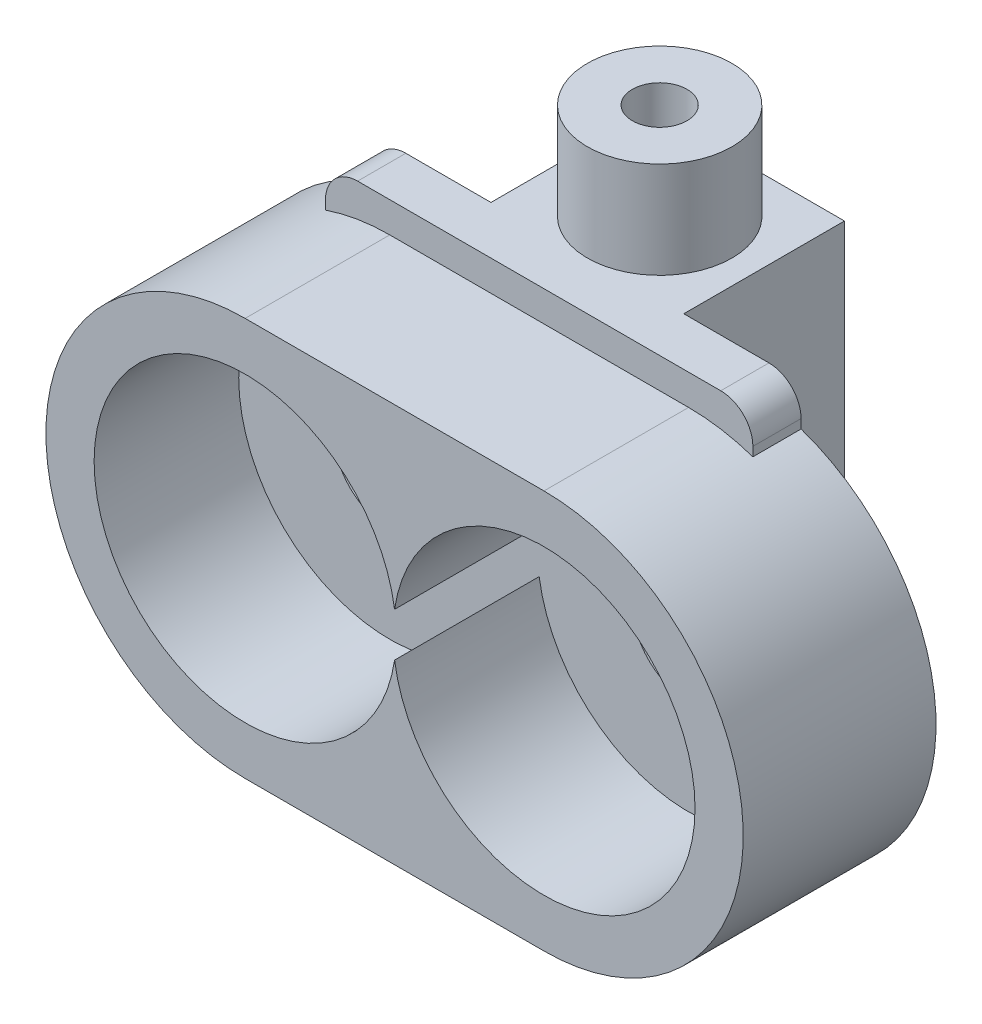
ISO-10303-21;
HEADER;
FILE_DESCRIPTION(('STEP AP214'),'2;1');
FILE_NAME('part.step','',(''),(''),'','','');
FILE_SCHEMA(('AUTOMOTIVE_DESIGN { 1 0 10303 214 1 1 1 1 }'));
ENDSEC;
DATA;
#1=APPLICATION_CONTEXT('core data for automotive mechanical design processes');
#2=APPLICATION_PROTOCOL_DEFINITION('international standard','automotive_design',2000,#1);
#3=PRODUCT_CONTEXT('',#1,'mechanical');
#4=PRODUCT('Part','Part','',(#3));
#5=PRODUCT_RELATED_PRODUCT_CATEGORY('part','',(#4));
#6=PRODUCT_DEFINITION_FORMATION('','',#4);
#7=PRODUCT_DEFINITION_CONTEXT('part definition',#1,'design');
#8=PRODUCT_DEFINITION('design','',#6,#7);
#9=PRODUCT_DEFINITION_SHAPE('','',#8);
#10=(LENGTH_UNIT() NAMED_UNIT(*) SI_UNIT(.MILLI.,.METRE.));
#11=(NAMED_UNIT(*) PLANE_ANGLE_UNIT() SI_UNIT($,.RADIAN.));
#12=(NAMED_UNIT(*) SI_UNIT($,.STERADIAN.) SOLID_ANGLE_UNIT());
#13=UNCERTAINTY_MEASURE_WITH_UNIT(LENGTH_MEASURE(1.E-05),#10,'distance_accuracy_value','');
#14=(GEOMETRIC_REPRESENTATION_CONTEXT(3) GLOBAL_UNCERTAINTY_ASSIGNED_CONTEXT((#13)) GLOBAL_UNIT_ASSIGNED_CONTEXT((#10,
#11,#12)) REPRESENTATION_CONTEXT('',''));
#15=CARTESIAN_POINT('',(0.,0.,0.));
#16=DIRECTION('',(0.,0.,1.));
#17=DIRECTION('',(1.,0.,0.));
#18=AXIS2_PLACEMENT_3D('',#15,#16,#17);
#19=CARTESIAN_POINT('',(136.,508.5,449.72));
#20=DIRECTION('',(0.,-1.,0.));
#21=DIRECTION('',(0.,0.,-1.));
#22=AXIS2_PLACEMENT_3D('',#19,#20,#21);
#23=PLANE('',#22);
#24=CARTESIAN_POINT('',(136.,508.5,449.72));
#25=DIRECTION('',(0.,-1.,0.));
#26=DIRECTION('',(1.,0.,0.));
#27=AXIS2_PLACEMENT_3D('',#24,#25,#26);
#28=CIRCLE('',#27,1.7);
#29=CARTESIAN_POINT('',(137.7,508.5,449.72));
#30=VERTEX_POINT('',#29);
#31=EDGE_CURVE('E23',#30,#30,#28,.T.);
#32=ORIENTED_EDGE('',*,*,#31,.F.);
#33=EDGE_LOOP('',(#32));
#34=FACE_BOUND('',#33,.T.);
#35=ADVANCED_FACE('F15',(#34),#23,.F.);
#36=CARTESIAN_POINT('',(136.,508.5,449.72));
#37=DIRECTION('',(0.,-1.,0.));
#38=DIRECTION('',(1.,0.,0.));
#39=AXIS2_PLACEMENT_3D('',#36,#37,#38);
#40=CYLINDRICAL_SURFACE('',#39,1.7);
#41=DIRECTION('',(0.,1.,0.));
#42=VECTOR('',#41,1.);
#43=CARTESIAN_POINT('',(137.7,508.5,449.72));
#44=LINE('',#43,#42);
#45=CARTESIAN_POINT('',(137.7,513.5,449.72));
#46=VERTEX_POINT('',#45);
#47=CARTESIAN_POINT('',(137.7,524.69,449.72));
#48=VERTEX_POINT('',#47);
#49=EDGE_CURVE('E9',#46,#48,#44,.T.);
#50=ORIENTED_EDGE('',*,*,#49,.T.);
#51=CARTESIAN_POINT('',(136.,524.69,449.72));
#52=DIRECTION('',(0.,-1.,0.));
#53=DIRECTION('',(1.,0.,0.));
#54=AXIS2_PLACEMENT_3D('',#51,#52,#53);
#55=CIRCLE('',#54,1.7);
#56=EDGE_CURVE('E316',#48,#48,#55,.T.);
#57=ORIENTED_EDGE('',*,*,#56,.F.);
#58=ORIENTED_EDGE('',*,*,#49,.F.);
#59=CARTESIAN_POINT('',(136.,513.5,449.72));
#60=DIRECTION('',(0.,-1.,0.));
#61=DIRECTION('',(1.,0.,0.));
#62=AXIS2_PLACEMENT_3D('',#59,#60,#61);
#63=CIRCLE('',#62,1.7);
#64=EDGE_CURVE('E413',#46,#46,#63,.T.);
#65=ORIENTED_EDGE('',*,*,#64,.T.);
#66=EDGE_LOOP('',(#50,#57,#58,#65));
#67=FACE_BOUND('',#66,.T.);
#68=ADVANCED_FACE('F670',(#67),#40,.F.);
#69=CARTESIAN_POINT('',(136.,508.5,449.72));
#70=DIRECTION('',(0.,-1.,0.));
#71=DIRECTION('',(1.,0.,0.));
#72=AXIS2_PLACEMENT_3D('',#69,#70,#71);
#73=CYLINDRICAL_SURFACE('',#72,1.7);
#74=CARTESIAN_POINT('',(136.,510.9,449.72));
#75=DIRECTION('',(0.,-1.,0.));
#76=DIRECTION('',(1.,0.,0.));
#77=AXIS2_PLACEMENT_3D('',#74,#75,#76);
#78=CIRCLE('',#77,1.7);
#79=CARTESIAN_POINT('',(137.7,510.9,449.72));
#80=VERTEX_POINT('',#79);
#81=EDGE_CURVE('E397',#80,#80,#78,.T.);
#82=ORIENTED_EDGE('',*,*,#81,.F.);
#83=DIRECTION('',(0.,1.,0.));
#84=VECTOR('',#83,1.);
#85=CARTESIAN_POINT('',(137.7,508.5,449.72));
#86=LINE('',#85,#84);
#87=EDGE_CURVE('E327',#30,#80,#86,.T.);
#88=ORIENTED_EDGE('',*,*,#87,.F.);
#89=ORIENTED_EDGE('',*,*,#31,.T.);
#90=ORIENTED_EDGE('',*,*,#87,.T.);
#91=EDGE_LOOP('',(#82,#88,#89,#90));
#92=FACE_BOUND('',#91,.T.);
#93=ADVANCED_FACE('F675',(#92),#73,.F.);
#94=CARTESIAN_POINT('',(133.1,510.9,453.12));
#95=DIRECTION('',(0.,0.,1.));
#96=DIRECTION('',(1.,0.,0.));
#97=AXIS2_PLACEMENT_3D('',#94,#95,#96);
#98=PLANE('',#97);
#99=DIRECTION('',(1.,0.,0.));
#100=VECTOR('',#99,1.);
#101=CARTESIAN_POINT('',(133.1,513.5,453.12));
#102=LINE('',#101,#100);
#103=CARTESIAN_POINT('',(133.1,513.5,453.12));
#104=VERTEX_POINT('',#103);
#105=CARTESIAN_POINT('',(138.9,513.5,453.12));
#106=VERTEX_POINT('',#105);
#107=EDGE_CURVE('E409',#104,#106,#102,.T.);
#108=ORIENTED_EDGE('',*,*,#107,.T.);
#109=DIRECTION('',(0.,1.,0.));
#110=VECTOR('',#109,1.);
#111=CARTESIAN_POINT('',(138.9,510.9,453.12));
#112=LINE('',#111,#110);
#113=CARTESIAN_POINT('',(138.9,510.9,453.12));
#114=VERTEX_POINT('',#113);
#115=EDGE_CURVE('E401',#114,#106,#112,.T.);
#116=ORIENTED_EDGE('',*,*,#115,.F.);
#117=DIRECTION('',(1.,0.,0.));
#118=VECTOR('',#117,1.);
#119=CARTESIAN_POINT('',(133.1,510.9,453.12));
#120=LINE('',#119,#118);
#121=CARTESIAN_POINT('',(133.1,510.9,453.12));
#122=VERTEX_POINT('',#121);
#123=EDGE_CURVE('E396',#122,#114,#120,.T.);
#124=ORIENTED_EDGE('',*,*,#123,.F.);
#125=DIRECTION('',(0.,1.,0.));
#126=VECTOR('',#125,1.);
#127=CARTESIAN_POINT('',(133.1,510.9,453.12));
#128=LINE('',#127,#126);
#129=EDGE_CURVE('E339',#122,#104,#128,.T.);
#130=ORIENTED_EDGE('',*,*,#129,.T.);
#131=EDGE_LOOP('',(#108,#116,#124,#130));
#132=FACE_BOUND('',#131,.T.);
#133=ADVANCED_FACE('F651',(#132),#98,.F.);
#134=CARTESIAN_POINT('',(136.,524.69,449.72));
#135=DIRECTION('',(0.,-1.,0.));
#136=DIRECTION('',(0.,0.,-1.));
#137=AXIS2_PLACEMENT_3D('',#134,#135,#136);
#138=PLANE('',#137);
#139=ORIENTED_EDGE('',*,*,#56,.T.);
#140=EDGE_LOOP('',(#139));
#141=FACE_BOUND('',#140,.T.);
#142=CARTESIAN_POINT('',(136.,524.69,449.72));
#143=DIRECTION('',(0.,-1.,0.));
#144=DIRECTION('',(1.,0.,0.));
#145=AXIS2_PLACEMENT_3D('',#142,#143,#144);
#146=CIRCLE('',#145,4.5);
#147=CARTESIAN_POINT('',(140.5,524.69,449.72));
#148=VERTEX_POINT('',#147);
#149=EDGE_CURVE('E277',#148,#148,#146,.T.);
#150=ORIENTED_EDGE('',*,*,#149,.F.);
#151=EDGE_LOOP('',(#150));
#152=FACE_BOUND('',#151,.T.);
#153=ADVANCED_FACE('F681',(#141,#152),#138,.F.);
#154=CARTESIAN_POINT('',(145.3,504.39,457.22));
#155=DIRECTION('',(0.,0.,-1.));
#156=DIRECTION('',(1.,0.,0.));
#157=AXIS2_PLACEMENT_3D('',#154,#155,#156);
#158=CYLINDRICAL_SURFACE('',#157,9.4);
#159=CARTESIAN_POINT('',(145.3,504.39,466.22));
#160=DIRECTION('',(0.,0.,-1.));
#161=DIRECTION('',(1.,0.,0.));
#162=AXIS2_PLACEMENT_3D('',#159,#160,#161);
#163=CIRCLE('',#162,9.4);
#164=CARTESIAN_POINT('',(154.7,504.39,466.22));
#165=VERTEX_POINT('',#164);
#166=CARTESIAN_POINT('',(136.,503.02252056689,466.22));
#167=VERTEX_POINT('',#166);
#168=EDGE_CURVE('E384',#165,#167,#163,.T.);
#169=ORIENTED_EDGE('',*,*,#168,.F.);
#170=DIRECTION('',(0.,0.,1.));
#171=VECTOR('',#170,1.);
#172=CARTESIAN_POINT('',(154.7,504.39,457.22));
#173=LINE('',#172,#171);
#174=CARTESIAN_POINT('',(154.7,504.39,457.22));
#175=VERTEX_POINT('',#174);
#176=EDGE_CURVE('E313',#175,#165,#173,.T.);
#177=ORIENTED_EDGE('',*,*,#176,.F.);
#178=CARTESIAN_POINT('',(145.3,504.39,457.22));
#179=DIRECTION('',(0.,0.,1.));
#180=DIRECTION('',(1.,0.,0.));
#181=AXIS2_PLACEMENT_3D('',#178,#179,#180);
#182=CIRCLE('',#181,9.4);
#183=CARTESIAN_POINT('',(136.,503.02252056688,457.22));
#184=VERTEX_POINT('',#183);
#185=EDGE_CURVE('E300',#184,#175,#182,.T.);
#186=ORIENTED_EDGE('',*,*,#185,.F.);
#187=DIRECTION('',(0.,0.,-1.));
#188=VECTOR('',#187,1.);
#189=CARTESIAN_POINT('',(136.,503.02252056688,457.22));
#190=LINE('',#189,#188);
#191=EDGE_CURVE('E317',#167,#184,#190,.T.);
#192=ORIENTED_EDGE('',*,*,#191,.F.);
#193=EDGE_LOOP('',(#169,#177,#186,#192));
#194=FACE_BOUND('',#193,.T.);
#195=ADVANCED_FACE('F686',(#194),#158,.F.);
#196=CARTESIAN_POINT('',(145.3,504.39,457.22));
#197=DIRECTION('',(0.,0.,-1.));
#198=DIRECTION('',(1.,0.,0.));
#199=AXIS2_PLACEMENT_3D('',#196,#197,#198);
#200=CYLINDRICAL_SURFACE('',#199,9.4);
#201=CARTESIAN_POINT('',(145.3,504.39,457.22));
#202=DIRECTION('',(0.,0.,1.));
#203=DIRECTION('',(1.,0.,0.));
#204=AXIS2_PLACEMENT_3D('',#201,#202,#203);
#205=CIRCLE('',#204,9.4);
#206=CARTESIAN_POINT('',(136.,505.75747943311,457.22));
#207=VERTEX_POINT('',#206);
#208=EDGE_CURVE('E375',#175,#207,#205,.T.);
#209=ORIENTED_EDGE('',*,*,#208,.F.);
#210=ORIENTED_EDGE('',*,*,#176,.T.);
#211=CARTESIAN_POINT('',(145.3,504.39,466.22));
#212=DIRECTION('',(0.,0.,-1.));
#213=DIRECTION('',(1.,0.,0.));
#214=AXIS2_PLACEMENT_3D('',#211,#212,#213);
#215=CIRCLE('',#214,9.4);
#216=CARTESIAN_POINT('',(136.,505.7574794331,466.22));
#217=VERTEX_POINT('',#216);
#218=EDGE_CURVE('E383',#217,#165,#215,.T.);
#219=ORIENTED_EDGE('',*,*,#218,.F.);
#220=DIRECTION('',(0.,0.,-1.));
#221=VECTOR('',#220,1.);
#222=CARTESIAN_POINT('',(136.,505.75747943311,457.22));
#223=LINE('',#222,#221);
#224=EDGE_CURVE('E336',#217,#207,#223,.T.);
#225=ORIENTED_EDGE('',*,*,#224,.T.);
#226=EDGE_LOOP('',(#209,#210,#219,#225));
#227=FACE_BOUND('',#226,.T.);
#228=ADVANCED_FACE('F690',(#227),#200,.F.);
#229=CARTESIAN_POINT('',(126.7,504.39,457.22));
#230=DIRECTION('',(0.,0.,-1.));
#231=DIRECTION('',(1.,0.,0.));
#232=AXIS2_PLACEMENT_3D('',#229,#230,#231);
#233=CYLINDRICAL_SURFACE('',#232,9.4);
#234=CARTESIAN_POINT('',(126.7,504.39,457.22));
#235=DIRECTION('',(0.,0.,1.));
#236=DIRECTION('',(1.,0.,0.));
#237=AXIS2_PLACEMENT_3D('',#234,#235,#236);
#238=CIRCLE('',#237,9.4);
#239=EDGE_CURVE('E298',#207,#184,#238,.T.);
#240=ORIENTED_EDGE('',*,*,#239,.F.);
#241=ORIENTED_EDGE('',*,*,#224,.F.);
#242=CARTESIAN_POINT('',(126.7,504.39,466.22));
#243=DIRECTION('',(0.,0.,-1.));
#244=DIRECTION('',(1.,0.,0.));
#245=AXIS2_PLACEMENT_3D('',#242,#243,#244);
#246=CIRCLE('',#245,9.4);
#247=EDGE_CURVE('E379',#167,#217,#246,.T.);
#248=ORIENTED_EDGE('',*,*,#247,.F.);
#249=ORIENTED_EDGE('',*,*,#191,.T.);
#250=EDGE_LOOP('',(#240,#241,#248,#249));
#251=FACE_BOUND('',#250,.T.);
#252=ADVANCED_FACE('F694',(#251),#233,.F.);
#253=CARTESIAN_POINT('',(133.1,510.9,409.72));
#254=DIRECTION('',(1.,0.,0.));
#255=DIRECTION('',(0.,1.,0.));
#256=AXIS2_PLACEMENT_3D('',#253,#254,#255);
#257=PLANE('',#256);
#258=DIRECTION('',(0.,0.,1.));
#259=VECTOR('',#258,1.);
#260=CARTESIAN_POINT('',(133.1,510.9,409.72));
#261=LINE('',#260,#259);
#262=CARTESIAN_POINT('',(133.1,510.9,444.22));
#263=VERTEX_POINT('',#262);
#264=EDGE_CURVE('E392',#263,#122,#261,.T.);
#265=ORIENTED_EDGE('',*,*,#264,.F.);
#266=DIRECTION('',(0.,1.,0.));
#267=VECTOR('',#266,1.);
#268=CARTESIAN_POINT('',(133.1,507.645,444.22));
#269=LINE('',#268,#267);
#270=CARTESIAN_POINT('',(133.1,513.5,444.22));
#271=VERTEX_POINT('',#270);
#272=EDGE_CURVE('E371',#263,#271,#269,.T.);
#273=ORIENTED_EDGE('',*,*,#272,.T.);
#274=DIRECTION('',(0.,0.,1.));
#275=VECTOR('',#274,1.);
#276=CARTESIAN_POINT('',(133.1,513.5,409.72));
#277=LINE('',#276,#275);
#278=EDGE_CURVE('E412',#271,#104,#277,.T.);
#279=ORIENTED_EDGE('',*,*,#278,.T.);
#280=ORIENTED_EDGE('',*,*,#129,.F.);
#281=EDGE_LOOP('',(#265,#273,#279,#280));
#282=FACE_BOUND('',#281,.T.);
#283=ADVANCED_FACE('F642',(#282),#257,.T.);
#284=CARTESIAN_POINT('',(133.1,513.5,409.72));
#285=DIRECTION('',(0.,1.,0.));
#286=DIRECTION('',(1.,0.,0.));
#287=AXIS2_PLACEMENT_3D('',#284,#285,#286);
#288=PLANE('',#287);
#289=ORIENTED_EDGE('',*,*,#64,.F.);
#290=EDGE_LOOP('',(#289));
#291=FACE_BOUND('',#290,.T.);
#292=ORIENTED_EDGE('',*,*,#107,.F.);
#293=ORIENTED_EDGE('',*,*,#278,.F.);
#294=DIRECTION('',(-1.,0.,0.));
#295=VECTOR('',#294,1.);
#296=CARTESIAN_POINT('',(131.55,513.5,444.22));
#297=LINE('',#296,#295);
#298=CARTESIAN_POINT('',(138.9,513.5,444.22));
#299=VERTEX_POINT('',#298);
#300=EDGE_CURVE('E367',#299,#271,#297,.T.);
#301=ORIENTED_EDGE('',*,*,#300,.F.);
#302=DIRECTION('',(0.,0.,1.));
#303=VECTOR('',#302,1.);
#304=CARTESIAN_POINT('',(138.9,513.5,409.72));
#305=LINE('',#304,#303);
#306=EDGE_CURVE('E405',#299,#106,#305,.T.);
#307=ORIENTED_EDGE('',*,*,#306,.T.);
#308=EDGE_LOOP('',(#292,#293,#301,#307));
#309=FACE_BOUND('',#308,.T.);
#310=ADVANCED_FACE('F649',(#291,#309),#288,.F.);
#311=CARTESIAN_POINT('',(138.9,510.9,409.72));
#312=DIRECTION('',(1.,0.,0.));
#313=DIRECTION('',(0.,1.,0.));
#314=AXIS2_PLACEMENT_3D('',#311,#312,#313);
#315=PLANE('',#314);
#316=ORIENTED_EDGE('',*,*,#115,.T.);
#317=ORIENTED_EDGE('',*,*,#306,.F.);
#318=DIRECTION('',(0.,1.,0.));
#319=VECTOR('',#318,1.);
#320=CARTESIAN_POINT('',(138.9,507.645,444.22));
#321=LINE('',#320,#319);
#322=CARTESIAN_POINT('',(138.9,510.9,444.22));
#323=VERTEX_POINT('',#322);
#324=EDGE_CURVE('E363',#323,#299,#321,.T.);
#325=ORIENTED_EDGE('',*,*,#324,.F.);
#326=DIRECTION('',(0.,0.,1.));
#327=VECTOR('',#326,1.);
#328=CARTESIAN_POINT('',(138.9,510.9,409.72));
#329=LINE('',#328,#327);
#330=EDGE_CURVE('E388',#323,#114,#329,.T.);
#331=ORIENTED_EDGE('',*,*,#330,.T.);
#332=EDGE_LOOP('',(#316,#317,#325,#331));
#333=FACE_BOUND('',#332,.T.);
#334=ADVANCED_FACE('F656',(#333),#315,.F.);
#335=CARTESIAN_POINT('',(133.1,510.9,409.72));
#336=DIRECTION('',(0.,1.,0.));
#337=DIRECTION('',(1.,0.,0.));
#338=AXIS2_PLACEMENT_3D('',#335,#336,#337);
#339=PLANE('',#338);
#340=ORIENTED_EDGE('',*,*,#81,.T.);
#341=EDGE_LOOP('',(#340));
#342=FACE_BOUND('',#341,.T.);
#343=ORIENTED_EDGE('',*,*,#330,.F.);
#344=DIRECTION('',(-1.,0.,0.));
#345=VECTOR('',#344,1.);
#346=CARTESIAN_POINT('',(131.55,510.9,444.22));
#347=LINE('',#346,#345);
#348=EDGE_CURVE('E301',#323,#263,#347,.T.);
#349=ORIENTED_EDGE('',*,*,#348,.T.);
#350=ORIENTED_EDGE('',*,*,#264,.T.);
#351=ORIENTED_EDGE('',*,*,#123,.T.);
#352=EDGE_LOOP('',(#343,#349,#350,#351));
#353=FACE_BOUND('',#352,.T.);
#354=ADVANCED_FACE('F654',(#342,#353),#339,.T.);
#355=CARTESIAN_POINT('',(126.7,516.79,454.22));
#356=DIRECTION('',(0.,1.,0.));
#357=DIRECTION('',(1.,0.,0.));
#358=AXIS2_PLACEMENT_3D('',#355,#356,#357);
#359=PLANE('',#358);
#360=DIRECTION('',(1.,0.,0.));
#361=VECTOR('',#360,1.);
#362=CARTESIAN_POINT('',(124.7,516.79,457.22));
#363=LINE('',#362,#361);
#364=CARTESIAN_POINT('',(126.7,516.79,457.22));
#365=VERTEX_POINT('',#364);
#366=CARTESIAN_POINT('',(145.3,516.79,457.22));
#367=VERTEX_POINT('',#366);
#368=EDGE_CURVE('E279',#365,#367,#363,.T.);
#369=ORIENTED_EDGE('',*,*,#368,.F.);
#370=DIRECTION('',(0.,0.,1.));
#371=VECTOR('',#370,1.);
#372=CARTESIAN_POINT('',(126.7,516.79,454.22));
#373=LINE('',#372,#371);
#374=CARTESIAN_POINT('',(126.7,516.79,466.22));
#375=VERTEX_POINT('',#374);
#376=EDGE_CURVE('E346',#365,#375,#373,.T.);
#377=ORIENTED_EDGE('',*,*,#376,.T.);
#378=DIRECTION('',(1.,0.,0.));
#379=VECTOR('',#378,1.);
#380=CARTESIAN_POINT('',(126.7,516.79,466.22));
#381=LINE('',#380,#379);
#382=CARTESIAN_POINT('',(145.3,516.79,466.22));
#383=VERTEX_POINT('',#382);
#384=EDGE_CURVE('E499',#375,#383,#381,.T.);
#385=ORIENTED_EDGE('',*,*,#384,.T.);
#386=DIRECTION('',(0.,0.,1.));
#387=VECTOR('',#386,1.);
#388=CARTESIAN_POINT('',(145.3,516.79,454.22));
#389=LINE('',#388,#387);
#390=EDGE_CURVE('E324',#367,#383,#389,.T.);
#391=ORIENTED_EDGE('',*,*,#390,.F.);
#392=EDGE_LOOP('',(#369,#377,#385,#391));
#393=FACE_BOUND('',#392,.T.);
#394=ADVANCED_FACE('F664',(#393),#359,.T.);
#395=CARTESIAN_POINT('',(126.7,491.99,466.22));
#396=DIRECTION('',(0.,0.,1.));
#397=DIRECTION('',(1.,0.,0.));
#398=AXIS2_PLACEMENT_3D('',#395,#396,#397);
#399=PLANE('',#398);
#400=ORIENTED_EDGE('',*,*,#168,.T.);
#401=ORIENTED_EDGE('',*,*,#247,.T.);
#402=ORIENTED_EDGE('',*,*,#218,.T.);
#403=EDGE_LOOP('',(#400,#401,#402));
#404=FACE_BOUND('',#403,.T.);
#405=ORIENTED_EDGE('',*,*,#384,.F.);
#406=CARTESIAN_POINT('',(126.7,504.39,466.22));
#407=DIRECTION('',(0.,0.,1.));
#408=DIRECTION('',(1.,0.,0.));
#409=AXIS2_PLACEMENT_3D('',#406,#407,#408);
#410=CIRCLE('',#409,12.4);
#411=CARTESIAN_POINT('',(126.7,491.99,466.22));
#412=VERTEX_POINT('',#411);
#413=EDGE_CURVE('E343',#375,#412,#410,.T.);
#414=ORIENTED_EDGE('',*,*,#413,.T.);
#415=DIRECTION('',(1.,0.,0.));
#416=VECTOR('',#415,1.);
#417=CARTESIAN_POINT('',(126.7,491.99,466.22));
#418=LINE('',#417,#416);
#419=CARTESIAN_POINT('',(145.3,491.99,466.22));
#420=VERTEX_POINT('',#419);
#421=EDGE_CURVE('E335',#412,#420,#418,.T.);
#422=ORIENTED_EDGE('',*,*,#421,.T.);
#423=CARTESIAN_POINT('',(145.3,504.39,466.22));
#424=DIRECTION('',(0.,0.,-1.));
#425=DIRECTION('',(-0.750000000000073,0.661437827766065,0.));
#426=AXIS2_PLACEMENT_3D('',#423,#424,#425);
#427=CIRCLE('',#426,12.4);
#428=EDGE_CURVE('E331',#383,#420,#427,.T.);
#429=ORIENTED_EDGE('',*,*,#428,.F.);
#430=EDGE_LOOP('',(#405,#414,#422,#429));
#431=FACE_BOUND('',#430,.T.);
#432=ADVANCED_FACE('F715',(#404,#431),#399,.T.);
#433=CARTESIAN_POINT('',(136.,518.68,449.72));
#434=DIRECTION('',(0.,-1.,0.));
#435=DIRECTION('',(1.,0.,0.));
#436=AXIS2_PLACEMENT_3D('',#433,#434,#435);
#437=CYLINDRICAL_SURFACE('',#436,4.5);
#438=CARTESIAN_POINT('',(136.,518.69,449.72));
#439=DIRECTION('',(0.,-1.,0.));
#440=DIRECTION('',(1.,0.,0.));
#441=AXIS2_PLACEMENT_3D('',#438,#439,#440);
#442=CIRCLE('',#441,4.5);
#443=CARTESIAN_POINT('',(140.5,518.69,449.72));
#444=VERTEX_POINT('',#443);
#445=EDGE_CURVE('E275',#444,#444,#442,.T.);
#446=ORIENTED_EDGE('',*,*,#445,.F.);
#447=DIRECTION('',(0.,1.,0.));
#448=VECTOR('',#447,1.);
#449=CARTESIAN_POINT('',(140.5,518.68,449.72));
#450=LINE('',#449,#448);
#451=EDGE_CURVE('E272',#444,#148,#450,.T.);
#452=ORIENTED_EDGE('',*,*,#451,.T.);
#453=ORIENTED_EDGE('',*,*,#149,.T.);
#454=ORIENTED_EDGE('',*,*,#451,.F.);
#455=EDGE_LOOP('',(#446,#452,#453,#454));
#456=FACE_BOUND('',#455,.T.);
#457=ADVANCED_FACE('F274',(#456),#437,.T.);
#458=CARTESIAN_POINT('',(122.7,510.39,457.22));
#459=DIRECTION('',(0.,0.,1.));
#460=DIRECTION('',(1.,0.,0.));
#461=AXIS2_PLACEMENT_3D('',#458,#459,#460);
#462=PLANE('',#461);
#463=DIRECTION('',(0.,1.,0.));
#464=VECTOR('',#463,1.);
#465=CARTESIAN_POINT('',(122.7,510.39,457.22));
#466=LINE('',#465,#464);
#467=CARTESIAN_POINT('',(122.7,516.12712060089,457.22));
#468=VERTEX_POINT('',#467);
#469=CARTESIAN_POINT('',(122.7,516.69,457.22));
#470=VERTEX_POINT('',#469);
#471=EDGE_CURVE('E358',#468,#470,#466,.T.);
#472=ORIENTED_EDGE('',*,*,#471,.F.);
#473=CARTESIAN_POINT('',(126.7,504.39,457.22));
#474=DIRECTION('',(0.,0.,-1.));
#475=DIRECTION('',(1.,0.,0.));
#476=AXIS2_PLACEMENT_3D('',#473,#474,#475);
#477=CIRCLE('',#476,12.4);
#478=EDGE_CURVE('E350',#468,#365,#477,.T.);
#479=ORIENTED_EDGE('',*,*,#478,.T.);
#480=ORIENTED_EDGE('',*,*,#368,.T.);
#481=CARTESIAN_POINT('',(145.3,504.39,457.22));
#482=DIRECTION('',(0.,0.,-1.));
#483=DIRECTION('',(1.,0.,0.));
#484=AXIS2_PLACEMENT_3D('',#481,#482,#483);
#485=CIRCLE('',#484,12.4);
#486=CARTESIAN_POINT('',(149.3,516.1271206009,457.22));
#487=VERTEX_POINT('',#486);
#488=EDGE_CURVE('E321',#367,#487,#485,.T.);
#489=ORIENTED_EDGE('',*,*,#488,.T.);
#490=DIRECTION('',(0.,1.,0.));
#491=VECTOR('',#490,1.);
#492=CARTESIAN_POINT('',(149.3,510.39,457.22));
#493=LINE('',#492,#491);
#494=CARTESIAN_POINT('',(149.3,516.69,457.22));
#495=VERTEX_POINT('',#494);
#496=EDGE_CURVE('E306',#487,#495,#493,.T.);
#497=ORIENTED_EDGE('',*,*,#496,.T.);
#498=CARTESIAN_POINT('',(147.3,516.69,457.22));
#499=DIRECTION('',(0.,0.,1.));
#500=DIRECTION('',(0.,-1.,0.));
#501=AXIS2_PLACEMENT_3D('',#498,#499,#500);
#502=CIRCLE('',#501,2.);
#503=CARTESIAN_POINT('',(147.3,518.69,457.22));
#504=VERTEX_POINT('',#503);
#505=EDGE_CURVE('E285',#495,#504,#502,.T.);
#506=ORIENTED_EDGE('',*,*,#505,.T.);
#507=DIRECTION('',(1.,0.,0.));
#508=VECTOR('',#507,1.);
#509=CARTESIAN_POINT('',(122.7,518.69,457.22));
#510=LINE('',#509,#508);
#511=CARTESIAN_POINT('',(124.7,518.69,457.22));
#512=VERTEX_POINT('',#511);
#513=EDGE_CURVE('E466',#512,#504,#510,.T.);
#514=ORIENTED_EDGE('',*,*,#513,.F.);
#515=CARTESIAN_POINT('',(124.7,516.69,457.22));
#516=DIRECTION('',(0.,0.,-1.));
#517=DIRECTION('',(0.,-1.,0.));
#518=AXIS2_PLACEMENT_3D('',#515,#516,#517);
#519=CIRCLE('',#518,2.);
#520=EDGE_CURVE('E362',#470,#512,#519,.T.);
#521=ORIENTED_EDGE('',*,*,#520,.F.);
#522=EDGE_LOOP('',(#472,#479,#480,#489,#497,#506,#514,#521));
#523=FACE_BOUND('',#522,.T.);
#524=ADVANCED_FACE('F591',(#523),#462,.T.);
#525=CARTESIAN_POINT('',(145.3,504.39,453.22));
#526=DIRECTION('',(0.,0.,1.));
#527=DIRECTION('',(1.,0.,0.));
#528=AXIS2_PLACEMENT_3D('',#525,#526,#527);
#529=PLANE('',#528);
#530=DIRECTION('',(0.,-1.,0.));
#531=VECTOR('',#530,1.);
#532=CARTESIAN_POINT('',(142.,504.39,453.22));
#533=LINE('',#532,#531);
#534=CARTESIAN_POINT('',(142.,505.55619037896,453.22));
#535=VERTEX_POINT('',#534);
#536=CARTESIAN_POINT('',(142.,504.39,453.22));
#537=VERTEX_POINT('',#536);
#538=EDGE_CURVE('E575',#535,#537,#533,.T.);
#539=ORIENTED_EDGE('',*,*,#538,.F.);
#540=CARTESIAN_POINT('',(145.3,504.39,453.22));
#541=DIRECTION('',(0.,0.,1.));
#542=DIRECTION('',(1.,0.,0.));
#543=AXIS2_PLACEMENT_3D('',#540,#541,#542);
#544=CIRCLE('',#543,3.5);
#545=CARTESIAN_POINT('',(141.8,504.39,453.22));
#546=VERTEX_POINT('',#545);
#547=EDGE_CURVE('E438',#535,#546,#544,.T.);
#548=ORIENTED_EDGE('',*,*,#547,.T.);
#549=DIRECTION('',(1.,0.,0.));
#550=VECTOR('',#549,1.);
#551=CARTESIAN_POINT('',(137.65,504.39,453.22));
#552=LINE('',#551,#550);
#553=EDGE_CURVE('E502',#546,#537,#552,.T.);
#554=ORIENTED_EDGE('',*,*,#553,.T.);
#555=EDGE_LOOP('',(#539,#548,#554));
#556=FACE_BOUND('',#555,.T.);
#557=ADVANCED_FACE('F717',(#556),#529,.T.);
#558=CARTESIAN_POINT('',(126.7,504.39,457.22));
#559=DIRECTION('',(0.,0.,1.));
#560=DIRECTION('',(1.,0.,0.));
#561=AXIS2_PLACEMENT_3D('',#558,#559,#560);
#562=PLANE('',#561);
#563=CARTESIAN_POINT('',(145.3,504.39,457.22));
#564=DIRECTION('',(0.,0.,-1.));
#565=DIRECTION('',(1.,0.,0.));
#566=AXIS2_PLACEMENT_3D('',#563,#564,#565);
#567=CIRCLE('',#566,3.5);
#568=CARTESIAN_POINT('',(148.8,504.39,457.22));
#569=VERTEX_POINT('',#568);
#570=EDGE_CURVE('E435',#569,#569,#567,.T.);
#571=ORIENTED_EDGE('',*,*,#570,.T.);
#572=EDGE_LOOP('',(#571));
#573=FACE_BOUND('',#572,.T.);
#574=CARTESIAN_POINT('',(126.7,504.39,457.22));
#575=DIRECTION('',(0.,0.,-1.));
#576=DIRECTION('',(1.,0.,0.));
#577=AXIS2_PLACEMENT_3D('',#574,#575,#576);
#578=CIRCLE('',#577,3.5);
#579=CARTESIAN_POINT('',(130.2,504.39,457.22));
#580=VERTEX_POINT('',#579);
#581=EDGE_CURVE('E507',#580,#580,#578,.T.);
#582=ORIENTED_EDGE('',*,*,#581,.T.);
#583=EDGE_LOOP('',(#582));
#584=FACE_BOUND('',#583,.T.);
#585=ORIENTED_EDGE('',*,*,#239,.T.);
#586=ORIENTED_EDGE('',*,*,#185,.T.);
#587=ORIENTED_EDGE('',*,*,#208,.T.);
#588=EDGE_LOOP('',(#585,#586,#587));
#589=FACE_BOUND('',#588,.T.);
#590=ADVANCED_FACE('F720',(#573,#584,#589),#562,.T.);
#591=CARTESIAN_POINT('',(130.,504.39,444.22));
#592=DIRECTION('',(0.,0.,1.));
#593=DIRECTION('',(1.,0.,0.));
#594=AXIS2_PLACEMENT_3D('',#591,#592,#593);
#595=PLANE('',#594);
#596=ORIENTED_EDGE('',*,*,#324,.T.);
#597=ORIENTED_EDGE('',*,*,#300,.T.);
#598=ORIENTED_EDGE('',*,*,#272,.F.);
#599=ORIENTED_EDGE('',*,*,#348,.F.);
#600=EDGE_LOOP('',(#596,#597,#598,#599));
#601=FACE_BOUND('',#600,.T.);
#602=DIRECTION('',(1.,0.,0.));
#603=VECTOR('',#602,1.);
#604=CARTESIAN_POINT('',(130.,518.69,444.22));
#605=LINE('',#604,#603);
#606=CARTESIAN_POINT('',(130.,518.69,444.22));
#607=VERTEX_POINT('',#606);
#608=CARTESIAN_POINT('',(142.,518.69,444.22));
#609=VERTEX_POINT('',#608);
#610=EDGE_CURVE('E286',#607,#609,#605,.T.);
#611=ORIENTED_EDGE('',*,*,#610,.T.);
#612=DIRECTION('',(0.,1.,0.));
#613=VECTOR('',#612,1.);
#614=CARTESIAN_POINT('',(142.,504.39,444.22));
#615=LINE('',#614,#613);
#616=CARTESIAN_POINT('',(142.,504.39,444.22));
#617=VERTEX_POINT('',#616);
#618=EDGE_CURVE('E568',#617,#609,#615,.T.);
#619=ORIENTED_EDGE('',*,*,#618,.F.);
#620=DIRECTION('',(1.,0.,0.));
#621=VECTOR('',#620,1.);
#622=CARTESIAN_POINT('',(130.,504.39,444.22));
#623=LINE('',#622,#621);
#624=CARTESIAN_POINT('',(130.,504.39,444.22));
#625=VERTEX_POINT('',#624);
#626=EDGE_CURVE('E555',#625,#617,#623,.T.);
#627=ORIENTED_EDGE('',*,*,#626,.F.);
#628=DIRECTION('',(0.,1.,0.));
#629=VECTOR('',#628,1.);
#630=CARTESIAN_POINT('',(130.,504.39,444.22));
#631=LINE('',#630,#629);
#632=EDGE_CURVE('E521',#625,#607,#631,.T.);
#633=ORIENTED_EDGE('',*,*,#632,.T.);
#634=EDGE_LOOP('',(#611,#619,#627,#633));
#635=FACE_BOUND('',#634,.T.);
#636=ADVANCED_FACE('F610',(#601,#635),#595,.F.);
#637=CARTESIAN_POINT('',(126.7,504.39,453.22));
#638=DIRECTION('',(0.,0.,1.));
#639=DIRECTION('',(1.,0.,0.));
#640=AXIS2_PLACEMENT_3D('',#637,#638,#639);
#641=PLANE('',#640);
#642=DIRECTION('',(1.,0.,0.));
#643=VECTOR('',#642,1.);
#644=CARTESIAN_POINT('',(128.35,504.39,453.22));
#645=LINE('',#644,#643);
#646=CARTESIAN_POINT('',(130.,504.39,453.22));
#647=VERTEX_POINT('',#646);
#648=CARTESIAN_POINT('',(130.2,504.39,453.22));
#649=VERTEX_POINT('',#648);
#650=EDGE_CURVE('E550',#647,#649,#645,.T.);
#651=ORIENTED_EDGE('',*,*,#650,.T.);
#652=CARTESIAN_POINT('',(126.7,504.39,453.22));
#653=DIRECTION('',(0.,0.,1.));
#654=DIRECTION('',(1.,0.,0.));
#655=AXIS2_PLACEMENT_3D('',#652,#653,#654);
#656=CIRCLE('',#655,3.5);
#657=CARTESIAN_POINT('',(130.,505.55619037896,453.22));
#658=VERTEX_POINT('',#657);
#659=EDGE_CURVE('E531',#649,#658,#656,.T.);
#660=ORIENTED_EDGE('',*,*,#659,.T.);
#661=DIRECTION('',(0.,-1.,0.));
#662=VECTOR('',#661,1.);
#663=CARTESIAN_POINT('',(130.,504.39,453.22));
#664=LINE('',#663,#662);
#665=EDGE_CURVE('E444',#658,#647,#664,.T.);
#666=ORIENTED_EDGE('',*,*,#665,.T.);
#667=EDGE_LOOP('',(#651,#660,#666));
#668=FACE_BOUND('',#667,.T.);
#669=ADVANCED_FACE('F728',(#668),#641,.T.);
#670=CARTESIAN_POINT('',(124.7,516.69,454.22));
#671=DIRECTION('',(0.,0.,1.));
#672=DIRECTION('',(-1.,0.,0.));
#673=AXIS2_PLACEMENT_3D('',#670,#671,#672);
#674=CYLINDRICAL_SURFACE('',#673,2.);
#675=DIRECTION('',(0.,0.,1.));
#676=VECTOR('',#675,1.);
#677=CARTESIAN_POINT('',(122.7,516.69,454.22));
#678=LINE('',#677,#676);
#679=CARTESIAN_POINT('',(122.7,516.69,454.22));
#680=VERTEX_POINT('',#679);
#681=EDGE_CURVE('E357',#680,#470,#678,.T.);
#682=ORIENTED_EDGE('',*,*,#681,.T.);
#683=ORIENTED_EDGE('',*,*,#520,.T.);
#684=DIRECTION('',(0.,0.,1.));
#685=VECTOR('',#684,1.);
#686=CARTESIAN_POINT('',(124.7,518.69,454.22));
#687=LINE('',#686,#685);
#688=CARTESIAN_POINT('',(124.7,518.69,454.22));
#689=VERTEX_POINT('',#688);
#690=EDGE_CURVE('E470',#689,#512,#687,.T.);
#691=ORIENTED_EDGE('',*,*,#690,.F.);
#692=CARTESIAN_POINT('',(124.7,516.69,454.22));
#693=DIRECTION('',(0.,0.,-1.));
#694=DIRECTION('',(0.,-1.,0.));
#695=AXIS2_PLACEMENT_3D('',#692,#693,#694);
#696=CIRCLE('',#695,2.);
#697=EDGE_CURVE('E456',#680,#689,#696,.T.);
#698=ORIENTED_EDGE('',*,*,#697,.F.);
#699=EDGE_LOOP('',(#682,#683,#691,#698));
#700=FACE_BOUND('',#699,.T.);
#701=ADVANCED_FACE('F731',(#700),#674,.T.);
#702=CARTESIAN_POINT('',(122.7,510.39,454.22));
#703=DIRECTION('',(1.,0.,0.));
#704=DIRECTION('',(0.,1.,0.));
#705=AXIS2_PLACEMENT_3D('',#702,#703,#704);
#706=PLANE('',#705);
#707=ORIENTED_EDGE('',*,*,#681,.F.);
#708=DIRECTION('',(0.,1.,0.));
#709=VECTOR('',#708,1.);
#710=CARTESIAN_POINT('',(122.7,510.39,454.22));
#711=LINE('',#710,#709);
#712=CARTESIAN_POINT('',(122.7,516.12712060089,454.22));
#713=VERTEX_POINT('',#712);
#714=EDGE_CURVE('E484',#713,#680,#711,.T.);
#715=ORIENTED_EDGE('',*,*,#714,.F.);
#716=DIRECTION('',(0.,0.,-1.));
#717=VECTOR('',#716,1.);
#718=CARTESIAN_POINT('',(122.7,516.12712060089,454.22));
#719=LINE('',#718,#717);
#720=EDGE_CURVE('E354',#468,#713,#719,.T.);
#721=ORIENTED_EDGE('',*,*,#720,.F.);
#722=ORIENTED_EDGE('',*,*,#471,.T.);
#723=EDGE_LOOP('',(#707,#715,#721,#722));
#724=FACE_BOUND('',#723,.T.);
#725=ADVANCED_FACE('F740',(#724),#706,.F.);
#726=CARTESIAN_POINT('',(126.7,504.39,454.22));
#727=DIRECTION('',(0.,0.,-1.));
#728=DIRECTION('',(1.,0.,0.));
#729=AXIS2_PLACEMENT_3D('',#726,#727,#728);
#730=CYLINDRICAL_SURFACE('',#729,12.4);
#731=DIRECTION('',(0.,0.,1.));
#732=VECTOR('',#731,1.);
#733=CARTESIAN_POINT('',(126.7,491.99,454.22));
#734=LINE('',#733,#732);
#735=CARTESIAN_POINT('',(126.7,491.99,454.22));
#736=VERTEX_POINT('',#735);
#737=EDGE_CURVE('E342',#736,#412,#734,.T.);
#738=ORIENTED_EDGE('',*,*,#737,.T.);
#739=ORIENTED_EDGE('',*,*,#413,.F.);
#740=ORIENTED_EDGE('',*,*,#376,.F.);
#741=ORIENTED_EDGE('',*,*,#478,.F.);
#742=ORIENTED_EDGE('',*,*,#720,.T.);
#743=CARTESIAN_POINT('',(126.7,504.39,454.22));
#744=DIRECTION('',(0.,0.,1.));
#745=DIRECTION('',(1.,0.,0.));
#746=AXIS2_PLACEMENT_3D('',#743,#744,#745);
#747=CIRCLE('',#746,12.4);
#748=EDGE_CURVE('E480',#713,#736,#747,.T.);
#749=ORIENTED_EDGE('',*,*,#748,.T.);
#750=EDGE_LOOP('',(#738,#739,#740,#741,#742,#749));
#751=FACE_BOUND('',#750,.T.);
#752=ADVANCED_FACE('F749',(#751),#730,.T.);
#753=CARTESIAN_POINT('',(126.7,491.99,454.22));
#754=DIRECTION('',(0.,1.,0.));
#755=DIRECTION('',(1.,0.,0.));
#756=AXIS2_PLACEMENT_3D('',#753,#754,#755);
#757=PLANE('',#756);
#758=DIRECTION('',(0.,0.,1.));
#759=VECTOR('',#758,1.);
#760=CARTESIAN_POINT('',(145.3,491.99,454.22));
#761=LINE('',#760,#759);
#762=CARTESIAN_POINT('',(145.3,491.99,454.22));
#763=VERTEX_POINT('',#762);
#764=EDGE_CURVE('E312',#763,#420,#761,.T.);
#765=ORIENTED_EDGE('',*,*,#764,.T.);
#766=ORIENTED_EDGE('',*,*,#421,.F.);
#767=ORIENTED_EDGE('',*,*,#737,.F.);
#768=DIRECTION('',(1.,0.,0.));
#769=VECTOR('',#768,1.);
#770=CARTESIAN_POINT('',(126.7,491.99,454.22));
#771=LINE('',#770,#769);
#772=EDGE_CURVE('E485',#736,#763,#771,.T.);
#773=ORIENTED_EDGE('',*,*,#772,.T.);
#774=EDGE_LOOP('',(#765,#766,#767,#773));
#775=FACE_BOUND('',#774,.T.);
#776=ADVANCED_FACE('F743',(#775),#757,.F.);
#777=CARTESIAN_POINT('',(145.3,504.39,454.22));
#778=DIRECTION('',(0.,0.,-1.));
#779=DIRECTION('',(1.,0.,0.));
#780=AXIS2_PLACEMENT_3D('',#777,#778,#779);
#781=CYLINDRICAL_SURFACE('',#780,12.4);
#782=ORIENTED_EDGE('',*,*,#764,.F.);
#783=CARTESIAN_POINT('',(145.3,504.39,454.22));
#784=DIRECTION('',(0.,0.,-1.));
#785=DIRECTION('',(-0.750000000000073,0.661437827766065,0.));
#786=AXIS2_PLACEMENT_3D('',#783,#784,#785);
#787=CIRCLE('',#786,12.4);
#788=CARTESIAN_POINT('',(149.3,516.12712060089,454.22));
#789=VERTEX_POINT('',#788);
#790=EDGE_CURVE('E489',#789,#763,#787,.T.);
#791=ORIENTED_EDGE('',*,*,#790,.F.);
#792=DIRECTION('',(0.,0.,-1.));
#793=VECTOR('',#792,1.);
#794=CARTESIAN_POINT('',(149.3,516.12712060089,454.22));
#795=LINE('',#794,#793);
#796=EDGE_CURVE('E309',#487,#789,#795,.T.);
#797=ORIENTED_EDGE('',*,*,#796,.F.);
#798=ORIENTED_EDGE('',*,*,#488,.F.);
#799=ORIENTED_EDGE('',*,*,#390,.T.);
#800=ORIENTED_EDGE('',*,*,#428,.T.);
#801=EDGE_LOOP('',(#782,#791,#797,#798,#799,#800));
#802=FACE_BOUND('',#801,.T.);
#803=ADVANCED_FACE('F737',(#802),#781,.T.);
#804=CARTESIAN_POINT('',(149.3,510.39,454.22));
#805=DIRECTION('',(1.,0.,0.));
#806=DIRECTION('',(0.,1.,0.));
#807=AXIS2_PLACEMENT_3D('',#804,#805,#806);
#808=PLANE('',#807);
#809=ORIENTED_EDGE('',*,*,#496,.F.);
#810=ORIENTED_EDGE('',*,*,#796,.T.);
#811=DIRECTION('',(0.,1.,0.));
#812=VECTOR('',#811,1.);
#813=CARTESIAN_POINT('',(149.3,510.39,454.22));
#814=LINE('',#813,#812);
#815=CARTESIAN_POINT('',(149.3,516.69,454.22));
#816=VERTEX_POINT('',#815);
#817=EDGE_CURVE('E464',#789,#816,#814,.T.);
#818=ORIENTED_EDGE('',*,*,#817,.T.);
#819=DIRECTION('',(0.,0.,1.));
#820=VECTOR('',#819,1.);
#821=CARTESIAN_POINT('',(149.3,516.69,454.22));
#822=LINE('',#821,#820);
#823=EDGE_CURVE('E292',#816,#495,#822,.T.);
#824=ORIENTED_EDGE('',*,*,#823,.T.);
#825=EDGE_LOOP('',(#809,#810,#818,#824));
#826=FACE_BOUND('',#825,.T.);
#827=ADVANCED_FACE('F596',(#826),#808,.T.);
#828=CARTESIAN_POINT('',(147.3,516.69,454.22));
#829=DIRECTION('',(0.,0.,1.));
#830=DIRECTION('',(1.,0.,0.));
#831=AXIS2_PLACEMENT_3D('',#828,#829,#830);
#832=CYLINDRICAL_SURFACE('',#831,2.);
#833=CARTESIAN_POINT('',(147.3,516.69,454.22));
#834=DIRECTION('',(0.,0.,1.));
#835=DIRECTION('',(0.,-1.,0.));
#836=AXIS2_PLACEMENT_3D('',#833,#834,#835);
#837=CIRCLE('',#836,2.);
#838=CARTESIAN_POINT('',(147.3,518.69,454.22));
#839=VERTEX_POINT('',#838);
#840=EDGE_CURVE('E460',#816,#839,#837,.T.);
#841=ORIENTED_EDGE('',*,*,#840,.T.);
#842=DIRECTION('',(0.,0.,1.));
#843=VECTOR('',#842,1.);
#844=CARTESIAN_POINT('',(147.3,518.69,454.22));
#845=LINE('',#844,#843);
#846=EDGE_CURVE('E294',#839,#504,#845,.T.);
#847=ORIENTED_EDGE('',*,*,#846,.T.);
#848=ORIENTED_EDGE('',*,*,#505,.F.);
#849=ORIENTED_EDGE('',*,*,#823,.F.);
#850=EDGE_LOOP('',(#841,#847,#848,#849));
#851=FACE_BOUND('',#850,.T.);
#852=ADVANCED_FACE('F585',(#851),#832,.T.);
#853=CARTESIAN_POINT('',(122.7,518.69,454.22));
#854=DIRECTION('',(0.,1.,0.));
#855=DIRECTION('',(1.,0.,0.));
#856=AXIS2_PLACEMENT_3D('',#853,#854,#855);
#857=PLANE('',#856);
#858=ORIENTED_EDGE('',*,*,#445,.T.);
#859=EDGE_LOOP('',(#858));
#860=FACE_BOUND('',#859,.T.);
#861=DIRECTION('',(1.,0.,0.));
#862=VECTOR('',#861,1.);
#863=CARTESIAN_POINT('',(122.7,518.69,454.22));
#864=LINE('',#863,#862);
#865=CARTESIAN_POINT('',(130.,518.69,454.22));
#866=VERTEX_POINT('',#865);
#867=EDGE_CURVE('E445',#689,#866,#864,.T.);
#868=ORIENTED_EDGE('',*,*,#867,.F.);
#869=ORIENTED_EDGE('',*,*,#690,.T.);
#870=ORIENTED_EDGE('',*,*,#513,.T.);
#871=ORIENTED_EDGE('',*,*,#846,.F.);
#872=DIRECTION('',(1.,0.,0.));
#873=VECTOR('',#872,1.);
#874=CARTESIAN_POINT('',(122.7,518.69,454.22));
#875=LINE('',#874,#873);
#876=CARTESIAN_POINT('',(142.,518.69,454.22));
#877=VERTEX_POINT('',#876);
#878=EDGE_CURVE('E465',#877,#839,#875,.T.);
#879=ORIENTED_EDGE('',*,*,#878,.F.);
#880=DIRECTION('',(0.,0.,1.));
#881=VECTOR('',#880,1.);
#882=CARTESIAN_POINT('',(142.,518.69,444.22));
#883=LINE('',#882,#881);
#884=EDGE_CURVE('E572',#609,#877,#883,.T.);
#885=ORIENTED_EDGE('',*,*,#884,.F.);
#886=ORIENTED_EDGE('',*,*,#610,.F.);
#887=DIRECTION('',(0.,0.,1.));
#888=VECTOR('',#887,1.);
#889=CARTESIAN_POINT('',(130.,518.69,444.22));
#890=LINE('',#889,#888);
#891=EDGE_CURVE('E518',#607,#866,#890,.T.);
#892=ORIENTED_EDGE('',*,*,#891,.T.);
#893=EDGE_LOOP('',(#868,#869,#870,#871,#879,#885,#886,#892));
#894=FACE_BOUND('',#893,.T.);
#895=ADVANCED_FACE('F282',(#860,#894),#857,.T.);
#896=CARTESIAN_POINT('',(142.,504.39,444.22));
#897=DIRECTION('',(1.,0.,0.));
#898=DIRECTION('',(0.,1.,0.));
#899=AXIS2_PLACEMENT_3D('',#896,#897,#898);
#900=PLANE('',#899);
#901=DIRECTION('',(0.,0.,1.));
#902=VECTOR('',#901,1.);
#903=CARTESIAN_POINT('',(142.,504.39,444.22));
#904=LINE('',#903,#902);
#905=EDGE_CURVE('E493',#617,#537,#904,.T.);
#906=ORIENTED_EDGE('',*,*,#905,.F.);
#907=ORIENTED_EDGE('',*,*,#618,.T.);
#908=ORIENTED_EDGE('',*,*,#884,.T.);
#909=DIRECTION('',(0.,1.,0.));
#910=VECTOR('',#909,1.);
#911=CARTESIAN_POINT('',(142.,504.39,454.22));
#912=LINE('',#911,#910);
#913=CARTESIAN_POINT('',(142.,505.55619037896,454.22));
#914=VERTEX_POINT('',#913);
#915=EDGE_CURVE('E449',#914,#877,#912,.T.);
#916=ORIENTED_EDGE('',*,*,#915,.F.);
#917=DIRECTION('',(0.,0.,-1.));
#918=VECTOR('',#917,1.);
#919=CARTESIAN_POINT('',(142.,505.55619037896,453.22));
#920=LINE('',#919,#918);
#921=EDGE_CURVE('E564',#914,#535,#920,.T.);
#922=ORIENTED_EDGE('',*,*,#921,.T.);
#923=ORIENTED_EDGE('',*,*,#538,.T.);
#924=EDGE_LOOP('',(#906,#907,#908,#916,#922,#923));
#925=FACE_BOUND('',#924,.T.);
#926=ADVANCED_FACE('F608',(#925),#900,.T.);
#927=CARTESIAN_POINT('',(145.3,504.39,453.22));
#928=DIRECTION('',(0.,0.,-1.));
#929=DIRECTION('',(1.,0.,0.));
#930=AXIS2_PLACEMENT_3D('',#927,#928,#929);
#931=CYLINDRICAL_SURFACE('',#930,3.5);
#932=CARTESIAN_POINT('',(145.3,504.39,454.22));
#933=DIRECTION('',(0.,0.,-1.));
#934=DIRECTION('',(1.,0.,0.));
#935=AXIS2_PLACEMENT_3D('',#932,#933,#934);
#936=CIRCLE('',#935,3.5);
#937=CARTESIAN_POINT('',(148.8,504.39,454.22));
#938=VERTEX_POINT('',#937);
#939=EDGE_CURVE('E433',#914,#938,#936,.T.);
#940=ORIENTED_EDGE('',*,*,#939,.T.);
#941=DIRECTION('',(0.,0.,1.));
#942=VECTOR('',#941,1.);
#943=CARTESIAN_POINT('',(148.8,504.39,453.22));
#944=LINE('',#943,#942);
#945=EDGE_CURVE('E439',#938,#569,#944,.T.);
#946=ORIENTED_EDGE('',*,*,#945,.T.);
#947=ORIENTED_EDGE('',*,*,#570,.F.);
#948=ORIENTED_EDGE('',*,*,#945,.F.);
#949=CARTESIAN_POINT('',(145.3,504.39,454.22));
#950=DIRECTION('',(0.,0.,-1.));
#951=DIRECTION('',(1.,0.,0.));
#952=AXIS2_PLACEMENT_3D('',#949,#950,#951);
#953=CIRCLE('',#952,3.5);
#954=CARTESIAN_POINT('',(141.79999999999,504.39,454.22));
#955=VERTEX_POINT('',#954);
#956=EDGE_CURVE('E431',#938,#955,#953,.T.);
#957=ORIENTED_EDGE('',*,*,#956,.T.);
#958=DIRECTION('',(0.,0.,-1.));
#959=VECTOR('',#958,1.);
#960=CARTESIAN_POINT('',(141.8,504.39,453.22));
#961=LINE('',#960,#959);
#962=EDGE_CURVE('E506',#955,#546,#961,.T.);
#963=ORIENTED_EDGE('',*,*,#962,.T.);
#964=ORIENTED_EDGE('',*,*,#547,.F.);
#965=ORIENTED_EDGE('',*,*,#921,.F.);
#966=EDGE_LOOP('',(#940,#946,#947,#948,#957,#963,#964,#965));
#967=FACE_BOUND('',#966,.T.);
#968=ADVANCED_FACE('F722',(#967),#931,.F.);
#969=CARTESIAN_POINT('',(130.,504.39,444.22));
#970=DIRECTION('',(0.,1.,0.));
#971=DIRECTION('',(1.,0.,0.));
#972=AXIS2_PLACEMENT_3D('',#969,#970,#971);
#973=PLANE('',#972);
#974=ORIENTED_EDGE('',*,*,#553,.F.);
#975=ORIENTED_EDGE('',*,*,#962,.F.);
#976=DIRECTION('',(-1.,0.,0.));
#977=VECTOR('',#976,1.);
#978=CARTESIAN_POINT('',(128.35,504.39,454.22));
#979=LINE('',#978,#977);
#980=CARTESIAN_POINT('',(130.2,504.39,454.22));
#981=VERTEX_POINT('',#980);
#982=EDGE_CURVE('E429',#955,#981,#979,.T.);
#983=ORIENTED_EDGE('',*,*,#982,.T.);
#984=DIRECTION('',(0.,0.,1.));
#985=VECTOR('',#984,1.);
#986=CARTESIAN_POINT('',(130.2,504.39,453.22));
#987=LINE('',#986,#985);
#988=EDGE_CURVE('E534',#649,#981,#987,.T.);
#989=ORIENTED_EDGE('',*,*,#988,.F.);
#990=ORIENTED_EDGE('',*,*,#650,.F.);
#991=DIRECTION('',(0.,0.,1.));
#992=VECTOR('',#991,1.);
#993=CARTESIAN_POINT('',(130.,504.39,444.22));
#994=LINE('',#993,#992);
#995=EDGE_CURVE('E527',#625,#647,#994,.T.);
#996=ORIENTED_EDGE('',*,*,#995,.F.);
#997=ORIENTED_EDGE('',*,*,#626,.T.);
#998=ORIENTED_EDGE('',*,*,#905,.T.);
#999=EDGE_LOOP('',(#974,#975,#983,#989,#990,#996,#997,#998));
#1000=FACE_BOUND('',#999,.T.);
#1001=ADVANCED_FACE('F711',(#1000),#973,.F.);
#1002=CARTESIAN_POINT('',(126.7,504.39,453.22));
#1003=DIRECTION('',(0.,0.,-1.));
#1004=DIRECTION('',(1.,0.,0.));
#1005=AXIS2_PLACEMENT_3D('',#1002,#1003,#1004);
#1006=CYLINDRICAL_SURFACE('',#1005,3.5);
#1007=ORIENTED_EDGE('',*,*,#659,.F.);
#1008=ORIENTED_EDGE('',*,*,#988,.T.);
#1009=DIRECTION('',(0.,0.,1.));
#1010=VECTOR('',#1009,1.);
#1011=CARTESIAN_POINT('',(130.2,504.39,453.22));
#1012=LINE('',#1011,#1010);
#1013=EDGE_CURVE('E538',#981,#580,#1012,.T.);
#1014=ORIENTED_EDGE('',*,*,#1013,.T.);
#1015=ORIENTED_EDGE('',*,*,#581,.F.);
#1016=ORIENTED_EDGE('',*,*,#1013,.F.);
#1017=CARTESIAN_POINT('',(126.7,504.39,454.22));
#1018=DIRECTION('',(0.,0.,-1.));
#1019=DIRECTION('',(1.,0.,0.));
#1020=AXIS2_PLACEMENT_3D('',#1017,#1018,#1019);
#1021=CIRCLE('',#1020,3.5);
#1022=CARTESIAN_POINT('',(130.,505.55619037901,454.22));
#1023=VERTEX_POINT('',#1022);
#1024=EDGE_CURVE('E630',#981,#1023,#1021,.T.);
#1025=ORIENTED_EDGE('',*,*,#1024,.T.);
#1026=DIRECTION('',(0.,0.,-1.));
#1027=VECTOR('',#1026,1.);
#1028=CARTESIAN_POINT('',(130.,505.55619037896,453.22));
#1029=LINE('',#1028,#1027);
#1030=EDGE_CURVE('E514',#1023,#658,#1029,.T.);
#1031=ORIENTED_EDGE('',*,*,#1030,.T.);
#1032=EDGE_LOOP('',(#1007,#1008,#1014,#1015,#1016,#1025,#1031));
#1033=FACE_BOUND('',#1032,.T.);
#1034=ADVANCED_FACE('F708',(#1033),#1006,.F.);
#1035=CARTESIAN_POINT('',(130.,504.39,444.22));
#1036=DIRECTION('',(1.,0.,0.));
#1037=DIRECTION('',(0.,1.,0.));
#1038=AXIS2_PLACEMENT_3D('',#1035,#1036,#1037);
#1039=PLANE('',#1038);
#1040=ORIENTED_EDGE('',*,*,#665,.F.);
#1041=ORIENTED_EDGE('',*,*,#1030,.F.);
#1042=DIRECTION('',(0.,-1.,0.));
#1043=VECTOR('',#1042,1.);
#1044=CARTESIAN_POINT('',(130.,518.69,454.22));
#1045=LINE('',#1044,#1043);
#1046=EDGE_CURVE('E440',#866,#1023,#1045,.T.);
#1047=ORIENTED_EDGE('',*,*,#1046,.F.);
#1048=ORIENTED_EDGE('',*,*,#891,.F.);
#1049=ORIENTED_EDGE('',*,*,#632,.F.);
#1050=ORIENTED_EDGE('',*,*,#995,.T.);
#1051=EDGE_LOOP('',(#1040,#1041,#1047,#1048,#1049,#1050));
#1052=FACE_BOUND('',#1051,.T.);
#1053=ADVANCED_FACE('F617',(#1052),#1039,.F.);
#1054=CARTESIAN_POINT('',(126.7,504.39,454.22));
#1055=DIRECTION('',(0.,0.,1.));
#1056=DIRECTION('',(1.,0.,0.));
#1057=AXIS2_PLACEMENT_3D('',#1054,#1055,#1056);
#1058=PLANE('',#1057);
#1059=ORIENTED_EDGE('',*,*,#1024,.F.);
#1060=ORIENTED_EDGE('',*,*,#982,.F.);
#1061=ORIENTED_EDGE('',*,*,#956,.F.);
#1062=ORIENTED_EDGE('',*,*,#939,.F.);
#1063=ORIENTED_EDGE('',*,*,#915,.T.);
#1064=ORIENTED_EDGE('',*,*,#878,.T.);
#1065=ORIENTED_EDGE('',*,*,#840,.F.);
#1066=ORIENTED_EDGE('',*,*,#817,.F.);
#1067=ORIENTED_EDGE('',*,*,#790,.T.);
#1068=ORIENTED_EDGE('',*,*,#772,.F.);
#1069=ORIENTED_EDGE('',*,*,#748,.F.);
#1070=ORIENTED_EDGE('',*,*,#714,.T.);
#1071=ORIENTED_EDGE('',*,*,#697,.T.);
#1072=ORIENTED_EDGE('',*,*,#867,.T.);
#1073=ORIENTED_EDGE('',*,*,#1046,.T.);
#1074=EDGE_LOOP('',(#1059,#1060,#1061,#1062,#1063,#1064,#1065,#1066,#1067,#1068,#1069,#1070,
#1071,#1072,#1073));
#1075=FACE_BOUND('',#1074,.T.);
#1076=ADVANCED_FACE('F602',(#1075),#1058,.F.);
#1077=CLOSED_SHELL('',(#35,#68,#93,#133,#153,#195,#228,#252,#283,#310,#334,#354,#394,#432,#457,
#524,#557,#590,#636,#669,#701,#725,#752,#776,#803,#827,#852,#895,#926,#968,#1001,#1034,#1053,#1076));
#1078=MANIFOLD_SOLID_BREP('B1',#1077);
#1079=ADVANCED_BREP_SHAPE_REPRESENTATION('',(#18,#1078),#14);
#1080=SHAPE_DEFINITION_REPRESENTATION(#9,#1079);
ENDSEC;
END-ISO-10303-21;
